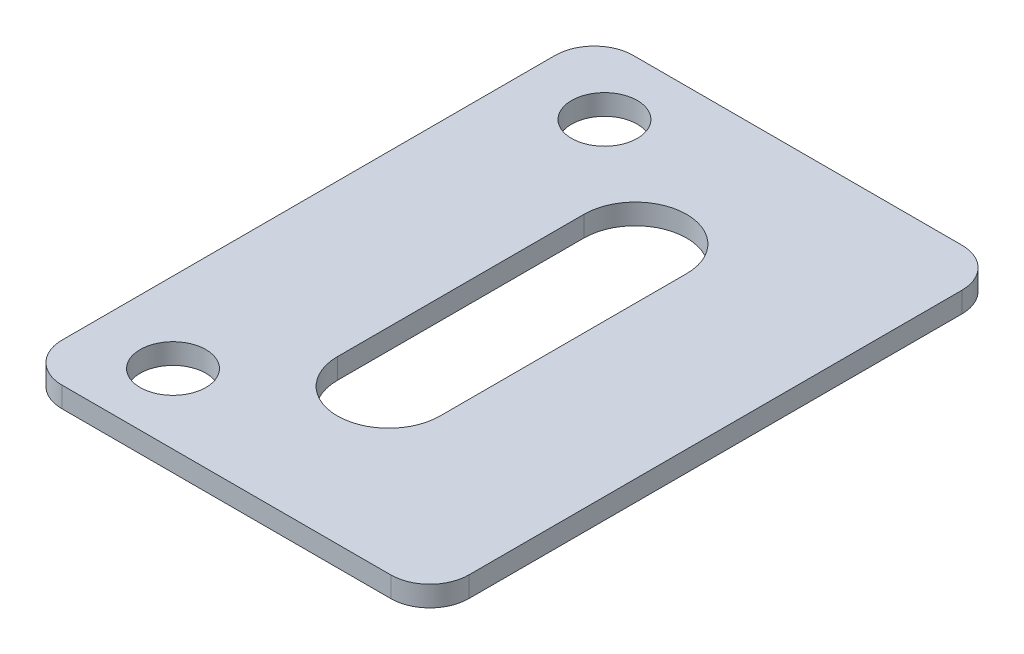
ISO-10303-21;
HEADER;
FILE_DESCRIPTION(('STEP AP214'),'2;1');
FILE_NAME('part.step','',(''),(''),'','','');
FILE_SCHEMA(('AUTOMOTIVE_DESIGN { 1 0 10303 214 1 1 1 1 }'));
ENDSEC;
DATA;
#1=APPLICATION_CONTEXT('core data for automotive mechanical design processes');
#2=APPLICATION_PROTOCOL_DEFINITION('international standard','automotive_design',2000,#1);
#3=PRODUCT_CONTEXT('',#1,'mechanical');
#4=PRODUCT('Part','Part','',(#3));
#5=PRODUCT_RELATED_PRODUCT_CATEGORY('part','',(#4));
#6=PRODUCT_DEFINITION_FORMATION('','',#4);
#7=PRODUCT_DEFINITION_CONTEXT('part definition',#1,'design');
#8=PRODUCT_DEFINITION('design','',#6,#7);
#9=PRODUCT_DEFINITION_SHAPE('','',#8);
#10=(LENGTH_UNIT() NAMED_UNIT(*) SI_UNIT(.MILLI.,.METRE.));
#11=(NAMED_UNIT(*) PLANE_ANGLE_UNIT() SI_UNIT($,.RADIAN.));
#12=(NAMED_UNIT(*) SI_UNIT($,.STERADIAN.) SOLID_ANGLE_UNIT());
#13=UNCERTAINTY_MEASURE_WITH_UNIT(LENGTH_MEASURE(1.E-05),#10,'distance_accuracy_value','');
#14=(GEOMETRIC_REPRESENTATION_CONTEXT(3) GLOBAL_UNCERTAINTY_ASSIGNED_CONTEXT((#13)) GLOBAL_UNIT_ASSIGNED_CONTEXT((#10,
#11,#12)) REPRESENTATION_CONTEXT('',''));
#15=CARTESIAN_POINT('',(0.,0.,0.));
#16=DIRECTION('',(0.,0.,1.));
#17=DIRECTION('',(1.,0.,0.));
#18=AXIS2_PLACEMENT_3D('',#15,#16,#17);
#19=CARTESIAN_POINT('',(0.,0.,0.));
#20=DIRECTION('',(0.,-1.,0.));
#21=DIRECTION('',(0.,0.,-1.));
#22=AXIS2_PLACEMENT_3D('',#19,#20,#21);
#23=PLANE('',#22);
#24=CARTESIAN_POINT('',(0.,0.,-6.));
#25=DIRECTION('',(0.,-1.,0.));
#26=DIRECTION('',(0.,0.,-1.));
#27=AXIS2_PLACEMENT_3D('',#24,#25,#26);
#28=CIRCLE('',#27,2.5);
#29=CARTESIAN_POINT('',(-2.5,0.,-6.));
#30=VERTEX_POINT('',#29);
#31=CARTESIAN_POINT('',(2.49999999999999,0.,-6.));
#32=VERTEX_POINT('',#31);
#33=EDGE_CURVE('E155',#30,#32,#28,.T.);
#34=ORIENTED_EDGE('',*,*,#33,.F.);
#35=DIRECTION('',(0.,0.,-1.));
#36=VECTOR('',#35,1.);
#37=CARTESIAN_POINT('',(-2.5,0.,0.));
#38=LINE('',#37,#36);
#39=CARTESIAN_POINT('',(-2.5,0.,6.));
#40=VERTEX_POINT('',#39);
#41=EDGE_CURVE('E148',#40,#30,#38,.T.);
#42=ORIENTED_EDGE('',*,*,#41,.F.);
#43=CARTESIAN_POINT('',(0.,0.,6.));
#44=DIRECTION('',(0.,-1.,0.));
#45=DIRECTION('',(0.,0.,-1.));
#46=AXIS2_PLACEMENT_3D('',#43,#44,#45);
#47=CIRCLE('',#46,2.5);
#48=CARTESIAN_POINT('',(2.5,0.,6.));
#49=VERTEX_POINT('',#48);
#50=EDGE_CURVE('E128',#49,#40,#47,.T.);
#51=ORIENTED_EDGE('',*,*,#50,.F.);
#52=DIRECTION('',(0.,0.,1.));
#53=VECTOR('',#52,1.);
#54=CARTESIAN_POINT('',(2.5,0.,0.));
#55=LINE('',#54,#53);
#56=EDGE_CURVE('E153',#32,#49,#55,.T.);
#57=ORIENTED_EDGE('',*,*,#56,.F.);
#58=EDGE_LOOP('',(#34,#42,#51,#57));
#59=FACE_BOUND('',#58,.T.);
#60=CARTESIAN_POINT('',(-6.,0.,10.5));
#61=DIRECTION('',(0.,-1.,0.));
#62=DIRECTION('',(0.,0.,-1.));
#63=AXIS2_PLACEMENT_3D('',#60,#61,#62);
#64=CIRCLE('',#63,1.6);
#65=CARTESIAN_POINT('',(-6.,0.,8.9));
#66=VERTEX_POINT('',#65);
#67=EDGE_CURVE('E162',#66,#66,#64,.T.);
#68=ORIENTED_EDGE('',*,*,#67,.F.);
#69=EDGE_LOOP('',(#68));
#70=FACE_BOUND('',#69,.T.);
#71=CARTESIAN_POINT('',(-6.,0.,-10.5));
#72=DIRECTION('',(0.,-1.,0.));
#73=DIRECTION('',(0.,0.,-1.));
#74=AXIS2_PLACEMENT_3D('',#71,#72,#73);
#75=CIRCLE('',#74,1.6);
#76=CARTESIAN_POINT('',(-6.,0.,-12.1));
#77=VERTEX_POINT('',#76);
#78=EDGE_CURVE('E157',#77,#77,#75,.T.);
#79=ORIENTED_EDGE('',*,*,#78,.F.);
#80=EDGE_LOOP('',(#79));
#81=FACE_BOUND('',#80,.T.);
#82=DIRECTION('',(1.,0.,0.));
#83=VECTOR('',#82,1.);
#84=CARTESIAN_POINT('',(-8.,0.,13.9));
#85=LINE('',#84,#83);
#86=CARTESIAN_POINT('',(-8.,0.,13.9));
#87=VERTEX_POINT('',#86);
#88=CARTESIAN_POINT('',(8.,0.,13.9));
#89=VERTEX_POINT('',#88);
#90=EDGE_CURVE('E172',#87,#89,#85,.T.);
#91=ORIENTED_EDGE('',*,*,#90,.F.);
#92=CARTESIAN_POINT('',(-8.,0.,12.));
#93=DIRECTION('',(0.,1.,0.));
#94=DIRECTION('',(0.,0.,1.));
#95=AXIS2_PLACEMENT_3D('',#92,#93,#94);
#96=CIRCLE('',#95,1.9);
#97=CARTESIAN_POINT('',(-9.9,0.,12.));
#98=VERTEX_POINT('',#97);
#99=EDGE_CURVE('E170',#98,#87,#96,.T.);
#100=ORIENTED_EDGE('',*,*,#99,.F.);
#101=DIRECTION('',(0.,0.,1.));
#102=VECTOR('',#101,1.);
#103=CARTESIAN_POINT('',(-9.9,0.,-12.));
#104=LINE('',#103,#102);
#105=CARTESIAN_POINT('',(-9.9,0.,-12.));
#106=VERTEX_POINT('',#105);
#107=EDGE_CURVE('E191',#106,#98,#104,.T.);
#108=ORIENTED_EDGE('',*,*,#107,.F.);
#109=CARTESIAN_POINT('',(-8.,0.,-12.));
#110=DIRECTION('',(0.,1.,0.));
#111=DIRECTION('',(0.,0.,1.));
#112=AXIS2_PLACEMENT_3D('',#109,#110,#111);
#113=CIRCLE('',#112,1.9);
#114=CARTESIAN_POINT('',(-8.,0.,-13.9));
#115=VERTEX_POINT('',#114);
#116=EDGE_CURVE('E188',#115,#106,#113,.T.);
#117=ORIENTED_EDGE('',*,*,#116,.F.);
#118=DIRECTION('',(-1.,0.,0.));
#119=VECTOR('',#118,1.);
#120=CARTESIAN_POINT('',(8.,0.,-13.9));
#121=LINE('',#120,#119);
#122=CARTESIAN_POINT('',(8.,0.,-13.9));
#123=VERTEX_POINT('',#122);
#124=EDGE_CURVE('E185',#123,#115,#121,.T.);
#125=ORIENTED_EDGE('',*,*,#124,.F.);
#126=CARTESIAN_POINT('',(8.,0.,-12.));
#127=DIRECTION('',(0.,1.,0.));
#128=DIRECTION('',(0.,0.,1.));
#129=AXIS2_PLACEMENT_3D('',#126,#127,#128);
#130=CIRCLE('',#129,1.9);
#131=CARTESIAN_POINT('',(9.9,0.,-12.));
#132=VERTEX_POINT('',#131);
#133=EDGE_CURVE('E182',#132,#123,#130,.T.);
#134=ORIENTED_EDGE('',*,*,#133,.F.);
#135=DIRECTION('',(0.,0.,-1.));
#136=VECTOR('',#135,1.);
#137=CARTESIAN_POINT('',(9.9,0.,12.));
#138=LINE('',#137,#136);
#139=CARTESIAN_POINT('',(9.9,0.,12.));
#140=VERTEX_POINT('',#139);
#141=EDGE_CURVE('E179',#140,#132,#138,.T.);
#142=ORIENTED_EDGE('',*,*,#141,.F.);
#143=CARTESIAN_POINT('',(8.,0.,12.));
#144=DIRECTION('',(0.,1.,0.));
#145=DIRECTION('',(0.,0.,1.));
#146=AXIS2_PLACEMENT_3D('',#143,#144,#145);
#147=CIRCLE('',#146,1.9);
#148=EDGE_CURVE('E176',#89,#140,#147,.T.);
#149=ORIENTED_EDGE('',*,*,#148,.F.);
#150=EDGE_LOOP('',(#91,#100,#108,#117,#125,#134,#142,#149));
#151=FACE_BOUND('',#150,.T.);
#152=ADVANCED_FACE('F33',(#59,#70,#81,#151),#23,.T.);
#153=CARTESIAN_POINT('',(-8.,0.,12.));
#154=DIRECTION('',(0.,1.,0.));
#155=DIRECTION('',(0.,0.,1.));
#156=AXIS2_PLACEMENT_3D('',#153,#154,#155);
#157=CYLINDRICAL_SURFACE('',#156,1.9);
#158=CARTESIAN_POINT('',(-8.,1.,12.));
#159=DIRECTION('',(0.,1.,0.));
#160=DIRECTION('',(0.,0.,1.));
#161=AXIS2_PLACEMENT_3D('',#158,#159,#160);
#162=CIRCLE('',#161,1.9);
#163=CARTESIAN_POINT('',(-9.9,1.,12.));
#164=VERTEX_POINT('',#163);
#165=CARTESIAN_POINT('',(-8.,1.,13.9));
#166=VERTEX_POINT('',#165);
#167=EDGE_CURVE('E161',#164,#166,#162,.T.);
#168=ORIENTED_EDGE('',*,*,#167,.F.);
#169=DIRECTION('',(0.,1.,0.));
#170=VECTOR('',#169,1.);
#171=CARTESIAN_POINT('',(-9.9,0.,12.));
#172=LINE('',#171,#170);
#173=EDGE_CURVE('E11',#98,#164,#172,.T.);
#174=ORIENTED_EDGE('',*,*,#173,.F.);
#175=ORIENTED_EDGE('',*,*,#99,.T.);
#176=DIRECTION('',(0.,1.,0.));
#177=VECTOR('',#176,1.);
#178=CARTESIAN_POINT('',(-8.,0.,13.9));
#179=LINE('',#178,#177);
#180=EDGE_CURVE('E36',#87,#166,#179,.T.);
#181=ORIENTED_EDGE('',*,*,#180,.T.);
#182=EDGE_LOOP('',(#168,#174,#175,#181));
#183=FACE_BOUND('',#182,.T.);
#184=ADVANCED_FACE('F231',(#183),#157,.T.);
#185=CARTESIAN_POINT('',(-9.9,0.,-12.));
#186=DIRECTION('',(-1.,0.,0.));
#187=DIRECTION('',(0.,0.,1.));
#188=AXIS2_PLACEMENT_3D('',#185,#186,#187);
#189=PLANE('',#188);
#190=DIRECTION('',(0.,0.,1.));
#191=VECTOR('',#190,1.);
#192=CARTESIAN_POINT('',(-9.9,1.,-12.));
#193=LINE('',#192,#191);
#194=CARTESIAN_POINT('',(-9.9,1.,-12.));
#195=VERTEX_POINT('',#194);
#196=EDGE_CURVE('E173',#195,#164,#193,.T.);
#197=ORIENTED_EDGE('',*,*,#196,.F.);
#198=DIRECTION('',(0.,1.,0.));
#199=VECTOR('',#198,1.);
#200=CARTESIAN_POINT('',(-9.9,0.,-12.));
#201=LINE('',#200,#199);
#202=EDGE_CURVE('E41',#106,#195,#201,.T.);
#203=ORIENTED_EDGE('',*,*,#202,.F.);
#204=ORIENTED_EDGE('',*,*,#107,.T.);
#205=ORIENTED_EDGE('',*,*,#173,.T.);
#206=EDGE_LOOP('',(#197,#203,#204,#205));
#207=FACE_BOUND('',#206,.T.);
#208=ADVANCED_FACE('F239',(#207),#189,.T.);
#209=CARTESIAN_POINT('',(-8.,0.,-12.));
#210=DIRECTION('',(0.,1.,0.));
#211=DIRECTION('',(0.,0.,1.));
#212=AXIS2_PLACEMENT_3D('',#209,#210,#211);
#213=CYLINDRICAL_SURFACE('',#212,1.9);
#214=CARTESIAN_POINT('',(-8.,1.,-12.));
#215=DIRECTION('',(0.,1.,0.));
#216=DIRECTION('',(0.,0.,1.));
#217=AXIS2_PLACEMENT_3D('',#214,#215,#216);
#218=CIRCLE('',#217,1.9);
#219=CARTESIAN_POINT('',(-8.,1.,-13.9));
#220=VERTEX_POINT('',#219);
#221=EDGE_CURVE('E211',#220,#195,#218,.T.);
#222=ORIENTED_EDGE('',*,*,#221,.F.);
#223=DIRECTION('',(0.,1.,0.));
#224=VECTOR('',#223,1.);
#225=CARTESIAN_POINT('',(-8.,0.,-13.9));
#226=LINE('',#225,#224);
#227=EDGE_CURVE('E217',#115,#220,#226,.T.);
#228=ORIENTED_EDGE('',*,*,#227,.F.);
#229=ORIENTED_EDGE('',*,*,#116,.T.);
#230=ORIENTED_EDGE('',*,*,#202,.T.);
#231=EDGE_LOOP('',(#222,#228,#229,#230));
#232=FACE_BOUND('',#231,.T.);
#233=ADVANCED_FACE('F259',(#232),#213,.T.);
#234=CARTESIAN_POINT('',(8.,0.,-13.9));
#235=DIRECTION('',(0.,0.,-1.));
#236=DIRECTION('',(-1.,0.,0.));
#237=AXIS2_PLACEMENT_3D('',#234,#235,#236);
#238=PLANE('',#237);
#239=DIRECTION('',(-1.,0.,0.));
#240=VECTOR('',#239,1.);
#241=CARTESIAN_POINT('',(8.,1.,-13.9));
#242=LINE('',#241,#240);
#243=CARTESIAN_POINT('',(8.,1.,-13.9));
#244=VERTEX_POINT('',#243);
#245=EDGE_CURVE('E208',#244,#220,#242,.T.);
#246=ORIENTED_EDGE('',*,*,#245,.F.);
#247=DIRECTION('',(0.,1.,0.));
#248=VECTOR('',#247,1.);
#249=CARTESIAN_POINT('',(8.,0.,-13.9));
#250=LINE('',#249,#248);
#251=EDGE_CURVE('E219',#123,#244,#250,.T.);
#252=ORIENTED_EDGE('',*,*,#251,.F.);
#253=ORIENTED_EDGE('',*,*,#124,.T.);
#254=ORIENTED_EDGE('',*,*,#227,.T.);
#255=EDGE_LOOP('',(#246,#252,#253,#254));
#256=FACE_BOUND('',#255,.T.);
#257=ADVANCED_FACE('F257',(#256),#238,.T.);
#258=CARTESIAN_POINT('',(8.,0.,-12.));
#259=DIRECTION('',(0.,1.,0.));
#260=DIRECTION('',(0.,0.,1.));
#261=AXIS2_PLACEMENT_3D('',#258,#259,#260);
#262=CYLINDRICAL_SURFACE('',#261,1.9);
#263=CARTESIAN_POINT('',(8.,1.,-12.));
#264=DIRECTION('',(0.,1.,0.));
#265=DIRECTION('',(0.,0.,1.));
#266=AXIS2_PLACEMENT_3D('',#263,#264,#265);
#267=CIRCLE('',#266,1.9);
#268=CARTESIAN_POINT('',(9.9,1.,-12.));
#269=VERTEX_POINT('',#268);
#270=EDGE_CURVE('E205',#269,#244,#267,.T.);
#271=ORIENTED_EDGE('',*,*,#270,.F.);
#272=DIRECTION('',(0.,1.,0.));
#273=VECTOR('',#272,1.);
#274=CARTESIAN_POINT('',(9.9,0.,-12.));
#275=LINE('',#274,#273);
#276=EDGE_CURVE('E221',#132,#269,#275,.T.);
#277=ORIENTED_EDGE('',*,*,#276,.F.);
#278=ORIENTED_EDGE('',*,*,#133,.T.);
#279=ORIENTED_EDGE('',*,*,#251,.T.);
#280=EDGE_LOOP('',(#271,#277,#278,#279));
#281=FACE_BOUND('',#280,.T.);
#282=ADVANCED_FACE('F253',(#281),#262,.T.);
#283=CARTESIAN_POINT('',(9.9,0.,12.));
#284=DIRECTION('',(1.,0.,0.));
#285=DIRECTION('',(0.,0.,-1.));
#286=AXIS2_PLACEMENT_3D('',#283,#284,#285);
#287=PLANE('',#286);
#288=DIRECTION('',(0.,0.,-1.));
#289=VECTOR('',#288,1.);
#290=CARTESIAN_POINT('',(9.9,1.,12.));
#291=LINE('',#290,#289);
#292=CARTESIAN_POINT('',(9.9,1.,12.));
#293=VERTEX_POINT('',#292);
#294=EDGE_CURVE('E202',#293,#269,#291,.T.);
#295=ORIENTED_EDGE('',*,*,#294,.F.);
#296=DIRECTION('',(0.,1.,0.));
#297=VECTOR('',#296,1.);
#298=CARTESIAN_POINT('',(9.9,0.,12.));
#299=LINE('',#298,#297);
#300=EDGE_CURVE('E223',#140,#293,#299,.T.);
#301=ORIENTED_EDGE('',*,*,#300,.F.);
#302=ORIENTED_EDGE('',*,*,#141,.T.);
#303=ORIENTED_EDGE('',*,*,#276,.T.);
#304=EDGE_LOOP('',(#295,#301,#302,#303));
#305=FACE_BOUND('',#304,.T.);
#306=ADVANCED_FACE('F251',(#305),#287,.T.);
#307=CARTESIAN_POINT('',(8.,0.,12.));
#308=DIRECTION('',(0.,1.,0.));
#309=DIRECTION('',(0.,0.,1.));
#310=AXIS2_PLACEMENT_3D('',#307,#308,#309);
#311=CYLINDRICAL_SURFACE('',#310,1.9);
#312=CARTESIAN_POINT('',(8.,1.,12.));
#313=DIRECTION('',(0.,1.,0.));
#314=DIRECTION('',(0.,0.,1.));
#315=AXIS2_PLACEMENT_3D('',#312,#313,#314);
#316=CIRCLE('',#315,1.9);
#317=CARTESIAN_POINT('',(8.,1.,13.9));
#318=VERTEX_POINT('',#317);
#319=EDGE_CURVE('E199',#318,#293,#316,.T.);
#320=ORIENTED_EDGE('',*,*,#319,.F.);
#321=DIRECTION('',(0.,1.,0.));
#322=VECTOR('',#321,1.);
#323=CARTESIAN_POINT('',(8.,0.,13.9));
#324=LINE('',#323,#322);
#325=EDGE_CURVE('E224',#89,#318,#324,.T.);
#326=ORIENTED_EDGE('',*,*,#325,.F.);
#327=ORIENTED_EDGE('',*,*,#148,.T.);
#328=ORIENTED_EDGE('',*,*,#300,.T.);
#329=EDGE_LOOP('',(#320,#326,#327,#328));
#330=FACE_BOUND('',#329,.T.);
#331=ADVANCED_FACE('F247',(#330),#311,.T.);
#332=CARTESIAN_POINT('',(-8.,0.,13.9));
#333=DIRECTION('',(0.,0.,1.));
#334=DIRECTION('',(1.,0.,0.));
#335=AXIS2_PLACEMENT_3D('',#332,#333,#334);
#336=PLANE('',#335);
#337=DIRECTION('',(1.,0.,0.));
#338=VECTOR('',#337,1.);
#339=CARTESIAN_POINT('',(-8.,1.,13.9));
#340=LINE('',#339,#338);
#341=EDGE_CURVE('E196',#166,#318,#340,.T.);
#342=ORIENTED_EDGE('',*,*,#341,.F.);
#343=ORIENTED_EDGE('',*,*,#180,.F.);
#344=ORIENTED_EDGE('',*,*,#90,.T.);
#345=ORIENTED_EDGE('',*,*,#325,.T.);
#346=EDGE_LOOP('',(#342,#343,#344,#345));
#347=FACE_BOUND('',#346,.T.);
#348=ADVANCED_FACE('F234',(#347),#336,.T.);
#349=CARTESIAN_POINT('',(0.,1.,0.));
#350=DIRECTION('',(0.,-1.,0.));
#351=DIRECTION('',(0.,0.,-1.));
#352=AXIS2_PLACEMENT_3D('',#349,#350,#351);
#353=PLANE('',#352);
#354=DIRECTION('',(0.,0.,1.));
#355=VECTOR('',#354,1.);
#356=CARTESIAN_POINT('',(-2.5,1.,-6.));
#357=LINE('',#356,#355);
#358=CARTESIAN_POINT('',(-2.5,1.,-6.));
#359=VERTEX_POINT('',#358);
#360=CARTESIAN_POINT('',(-2.5,1.,6.));
#361=VERTEX_POINT('',#360);
#362=EDGE_CURVE('E134',#359,#361,#357,.T.);
#363=ORIENTED_EDGE('',*,*,#362,.F.);
#364=CARTESIAN_POINT('',(0.,1.,-6.));
#365=DIRECTION('',(0.,1.,0.));
#366=DIRECTION('',(0.,0.,1.));
#367=AXIS2_PLACEMENT_3D('',#364,#365,#366);
#368=CIRCLE('',#367,2.5);
#369=CARTESIAN_POINT('',(2.49999999999999,1.,-6.));
#370=VERTEX_POINT('',#369);
#371=EDGE_CURVE('E57',#370,#359,#368,.T.);
#372=ORIENTED_EDGE('',*,*,#371,.F.);
#373=DIRECTION('',(0.,0.,-1.));
#374=VECTOR('',#373,1.);
#375=CARTESIAN_POINT('',(2.49999999999999,1.,-6.));
#376=LINE('',#375,#374);
#377=CARTESIAN_POINT('',(2.5,1.,6.));
#378=VERTEX_POINT('',#377);
#379=EDGE_CURVE('E141',#378,#370,#376,.T.);
#380=ORIENTED_EDGE('',*,*,#379,.F.);
#381=CARTESIAN_POINT('',(0.,1.,6.));
#382=DIRECTION('',(0.,1.,0.));
#383=DIRECTION('',(0.,0.,1.));
#384=AXIS2_PLACEMENT_3D('',#381,#382,#383);
#385=CIRCLE('',#384,2.5);
#386=EDGE_CURVE('E125',#361,#378,#385,.T.);
#387=ORIENTED_EDGE('',*,*,#386,.F.);
#388=EDGE_LOOP('',(#363,#372,#380,#387));
#389=FACE_BOUND('',#388,.T.);
#390=CARTESIAN_POINT('',(-6.,1.,10.5));
#391=DIRECTION('',(0.,-1.,0.));
#392=DIRECTION('',(0.,0.,-1.));
#393=AXIS2_PLACEMENT_3D('',#390,#391,#392);
#394=CIRCLE('',#393,1.6);
#395=CARTESIAN_POINT('',(-6.,1.,8.9));
#396=VERTEX_POINT('',#395);
#397=EDGE_CURVE('E158',#396,#396,#394,.T.);
#398=ORIENTED_EDGE('',*,*,#397,.T.);
#399=EDGE_LOOP('',(#398));
#400=FACE_BOUND('',#399,.T.);
#401=CARTESIAN_POINT('',(-6.,1.,-10.5));
#402=DIRECTION('',(0.,-1.,0.));
#403=DIRECTION('',(0.,0.,-1.));
#404=AXIS2_PLACEMENT_3D('',#401,#402,#403);
#405=CIRCLE('',#404,1.6);
#406=CARTESIAN_POINT('',(-6.,1.,-12.1));
#407=VERTEX_POINT('',#406);
#408=EDGE_CURVE('E165',#407,#407,#405,.T.);
#409=ORIENTED_EDGE('',*,*,#408,.T.);
#410=EDGE_LOOP('',(#409));
#411=FACE_BOUND('',#410,.T.);
#412=ORIENTED_EDGE('',*,*,#167,.T.);
#413=ORIENTED_EDGE('',*,*,#341,.T.);
#414=ORIENTED_EDGE('',*,*,#319,.T.);
#415=ORIENTED_EDGE('',*,*,#294,.T.);
#416=ORIENTED_EDGE('',*,*,#270,.T.);
#417=ORIENTED_EDGE('',*,*,#245,.T.);
#418=ORIENTED_EDGE('',*,*,#221,.T.);
#419=ORIENTED_EDGE('',*,*,#196,.T.);
#420=EDGE_LOOP('',(#412,#413,#414,#415,#416,#417,#418,#419));
#421=FACE_BOUND('',#420,.T.);
#422=ADVANCED_FACE('F138',(#389,#400,#411,#421),#353,.F.);
#423=CARTESIAN_POINT('',(-6.,1.,-10.5));
#424=DIRECTION('',(0.,-1.,0.));
#425=DIRECTION('',(0.,0.,-1.));
#426=AXIS2_PLACEMENT_3D('',#423,#424,#425);
#427=CYLINDRICAL_SURFACE('',#426,1.6);
#428=ORIENTED_EDGE('',*,*,#408,.F.);
#429=EDGE_LOOP('',(#428));
#430=FACE_BOUND('',#429,.T.);
#431=ORIENTED_EDGE('',*,*,#78,.T.);
#432=EDGE_LOOP('',(#431));
#433=FACE_BOUND('',#432,.T.);
#434=ADVANCED_FACE('F281',(#430,#433),#427,.F.);
#435=CARTESIAN_POINT('',(-6.,1.,10.5));
#436=DIRECTION('',(0.,-1.,0.));
#437=DIRECTION('',(0.,0.,-1.));
#438=AXIS2_PLACEMENT_3D('',#435,#436,#437);
#439=CYLINDRICAL_SURFACE('',#438,1.6);
#440=ORIENTED_EDGE('',*,*,#397,.F.);
#441=EDGE_LOOP('',(#440));
#442=FACE_BOUND('',#441,.T.);
#443=ORIENTED_EDGE('',*,*,#67,.T.);
#444=EDGE_LOOP('',(#443));
#445=FACE_BOUND('',#444,.T.);
#446=ADVANCED_FACE('F283',(#442,#445),#439,.F.);
#447=CARTESIAN_POINT('',(0.,-9.,-6.));
#448=DIRECTION('',(0.,1.,0.));
#449=DIRECTION('',(0.,0.,1.));
#450=AXIS2_PLACEMENT_3D('',#447,#448,#449);
#451=CYLINDRICAL_SURFACE('',#450,2.5);
#452=ORIENTED_EDGE('',*,*,#33,.T.);
#453=DIRECTION('',(0.,1.,0.));
#454=VECTOR('',#453,1.);
#455=CARTESIAN_POINT('',(2.49999999999999,-9.,-6.));
#456=LINE('',#455,#454);
#457=EDGE_CURVE('E146',#32,#370,#456,.T.);
#458=ORIENTED_EDGE('',*,*,#457,.T.);
#459=ORIENTED_EDGE('',*,*,#371,.T.);
#460=DIRECTION('',(0.,1.,0.));
#461=VECTOR('',#460,1.);
#462=CARTESIAN_POINT('',(-2.5,-9.,-6.));
#463=LINE('',#462,#461);
#464=EDGE_CURVE('E131',#30,#359,#463,.T.);
#465=ORIENTED_EDGE('',*,*,#464,.F.);
#466=EDGE_LOOP('',(#452,#458,#459,#465));
#467=FACE_BOUND('',#466,.T.);
#468=ADVANCED_FACE('F290',(#467),#451,.F.);
#469=CARTESIAN_POINT('',(2.49999999999999,-9.,-6.));
#470=DIRECTION('',(1.,0.,0.));
#471=DIRECTION('',(0.,0.,-1.));
#472=AXIS2_PLACEMENT_3D('',#469,#470,#471);
#473=PLANE('',#472);
#474=ORIENTED_EDGE('',*,*,#56,.T.);
#475=DIRECTION('',(0.,1.,0.));
#476=VECTOR('',#475,1.);
#477=CARTESIAN_POINT('',(2.5,-9.,6.));
#478=LINE('',#477,#476);
#479=EDGE_CURVE('E130',#49,#378,#478,.T.);
#480=ORIENTED_EDGE('',*,*,#479,.T.);
#481=ORIENTED_EDGE('',*,*,#379,.T.);
#482=ORIENTED_EDGE('',*,*,#457,.F.);
#483=EDGE_LOOP('',(#474,#480,#481,#482));
#484=FACE_BOUND('',#483,.T.);
#485=ADVANCED_FACE('F297',(#484),#473,.F.);
#486=CARTESIAN_POINT('',(0.,-9.,6.));
#487=DIRECTION('',(0.,1.,0.));
#488=DIRECTION('',(0.,0.,1.));
#489=AXIS2_PLACEMENT_3D('',#486,#487,#488);
#490=CYLINDRICAL_SURFACE('',#489,2.5);
#491=ORIENTED_EDGE('',*,*,#50,.T.);
#492=DIRECTION('',(0.,1.,0.));
#493=VECTOR('',#492,1.);
#494=CARTESIAN_POINT('',(-2.5,-9.,6.));
#495=LINE('',#494,#493);
#496=EDGE_CURVE('E49',#40,#361,#495,.T.);
#497=ORIENTED_EDGE('',*,*,#496,.T.);
#498=ORIENTED_EDGE('',*,*,#386,.T.);
#499=ORIENTED_EDGE('',*,*,#479,.F.);
#500=EDGE_LOOP('',(#491,#497,#498,#499));
#501=FACE_BOUND('',#500,.T.);
#502=ADVANCED_FACE('F122',(#501),#490,.F.);
#503=CARTESIAN_POINT('',(-2.5,-9.,-6.));
#504=DIRECTION('',(-1.,0.,0.));
#505=DIRECTION('',(0.,0.,1.));
#506=AXIS2_PLACEMENT_3D('',#503,#504,#505);
#507=PLANE('',#506);
#508=ORIENTED_EDGE('',*,*,#41,.T.);
#509=ORIENTED_EDGE('',*,*,#464,.T.);
#510=ORIENTED_EDGE('',*,*,#362,.T.);
#511=ORIENTED_EDGE('',*,*,#496,.F.);
#512=EDGE_LOOP('',(#508,#509,#510,#511));
#513=FACE_BOUND('',#512,.T.);
#514=ADVANCED_FACE('F135',(#513),#507,.F.);
#515=CLOSED_SHELL('',(#152,#184,#208,#233,#257,#282,#306,#331,#348,#422,#434,#446,#468,#485,
#502,#514));
#516=MANIFOLD_SOLID_BREP('B2',#515);
#517=ADVANCED_BREP_SHAPE_REPRESENTATION('',(#18,#516),#14);
#518=SHAPE_DEFINITION_REPRESENTATION(#9,#517);
ENDSEC;
END-ISO-10303-21;
